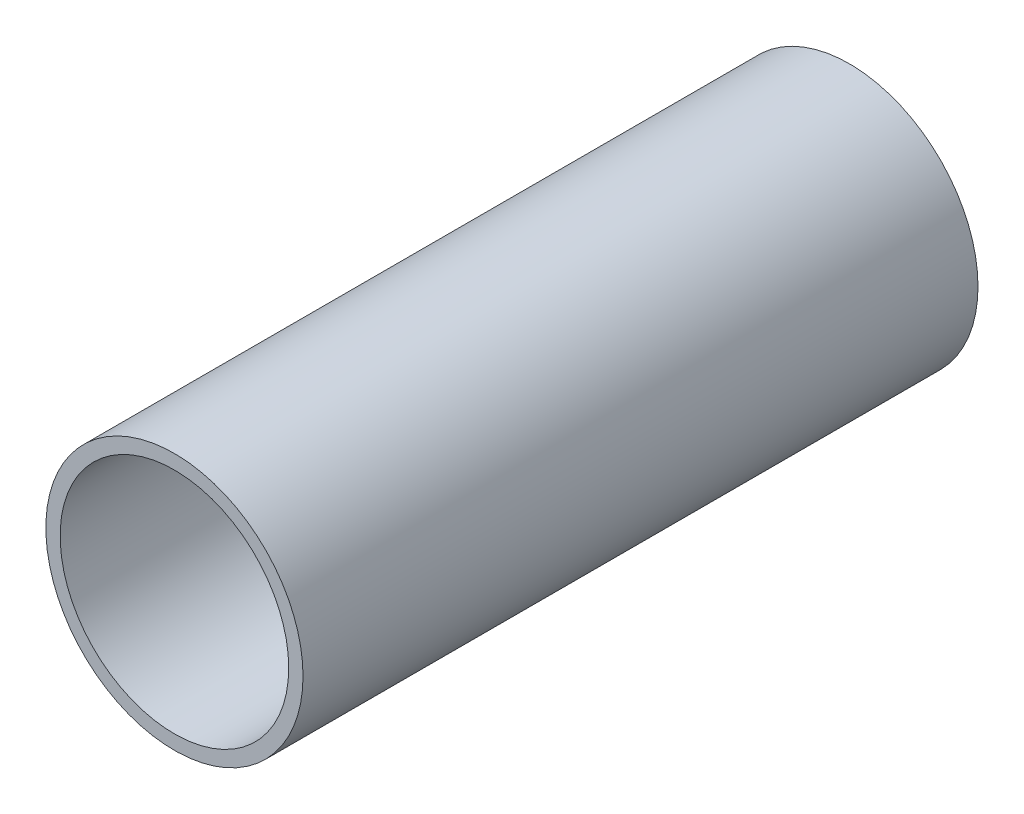
ISO-10303-21;
HEADER;
FILE_DESCRIPTION(('STEP AP214'),'2;1');
FILE_NAME('part.step','',(''),(''),'','','');
FILE_SCHEMA(('AUTOMOTIVE_DESIGN { 1 0 10303 214 1 1 1 1 }'));
ENDSEC;
DATA;
#1=APPLICATION_CONTEXT('core data for automotive mechanical design processes');
#2=APPLICATION_PROTOCOL_DEFINITION('international standard','automotive_design',2000,#1);
#3=PRODUCT_CONTEXT('',#1,'mechanical');
#4=PRODUCT('Part','Part','',(#3));
#5=PRODUCT_RELATED_PRODUCT_CATEGORY('part','',(#4));
#6=PRODUCT_DEFINITION_FORMATION('','',#4);
#7=PRODUCT_DEFINITION_CONTEXT('part definition',#1,'design');
#8=PRODUCT_DEFINITION('design','',#6,#7);
#9=PRODUCT_DEFINITION_SHAPE('','',#8);
#10=(LENGTH_UNIT() NAMED_UNIT(*) SI_UNIT(.MILLI.,.METRE.));
#11=(NAMED_UNIT(*) PLANE_ANGLE_UNIT() SI_UNIT($,.RADIAN.));
#12=(NAMED_UNIT(*) SI_UNIT($,.STERADIAN.) SOLID_ANGLE_UNIT());
#13=UNCERTAINTY_MEASURE_WITH_UNIT(LENGTH_MEASURE(1.E-05),#10,'distance_accuracy_value','');
#14=(GEOMETRIC_REPRESENTATION_CONTEXT(3) GLOBAL_UNCERTAINTY_ASSIGNED_CONTEXT((#13)) GLOBAL_UNIT_ASSIGNED_CONTEXT((#10,
#11,#12)) REPRESENTATION_CONTEXT('',''));
#15=CARTESIAN_POINT('',(0.,0.,0.));
#16=DIRECTION('',(0.,0.,1.));
#17=DIRECTION('',(1.,0.,0.));
#18=AXIS2_PLACEMENT_3D('',#15,#16,#17);
#19=CARTESIAN_POINT('',(0.,0.,300.));
#20=DIRECTION('',(0.,0.,1.));
#21=DIRECTION('',(1.,0.,0.));
#22=AXIS2_PLACEMENT_3D('',#19,#20,#21);
#23=PLANE('',#22);
#24=CARTESIAN_POINT('',(0.,0.,300.));
#25=DIRECTION('',(0.,0.,1.));
#26=DIRECTION('',(1.,0.,0.));
#27=AXIS2_PLACEMENT_3D('',#24,#25,#26);
#28=CIRCLE('',#27,57.15);
#29=CARTESIAN_POINT('',(57.15,0.,300.));
#30=VERTEX_POINT('',#29);
#31=EDGE_CURVE('E10',#30,#30,#28,.T.);
#32=ORIENTED_EDGE('',*,*,#31,.T.);
#33=EDGE_LOOP('',(#32));
#34=FACE_BOUND('',#33,.T.);
#35=CARTESIAN_POINT('',(0.,0.,300.));
#36=DIRECTION('',(0.,0.,1.));
#37=DIRECTION('',(1.,0.,0.));
#38=AXIS2_PLACEMENT_3D('',#35,#36,#37);
#39=CIRCLE('',#38,50.8);
#40=CARTESIAN_POINT('',(50.8,0.,300.));
#41=VERTEX_POINT('',#40);
#42=EDGE_CURVE('E54',#41,#41,#39,.T.);
#43=ORIENTED_EDGE('',*,*,#42,.F.);
#44=EDGE_LOOP('',(#43));
#45=FACE_BOUND('',#44,.T.);
#46=ADVANCED_FACE('F41',(#34,#45),#23,.T.);
#47=CARTESIAN_POINT('',(0.,0.,0.));
#48=DIRECTION('',(0.,0.,1.));
#49=DIRECTION('',(1.,0.,0.));
#50=AXIS2_PLACEMENT_3D('',#47,#48,#49);
#51=PLANE('',#50);
#52=CARTESIAN_POINT('',(0.,0.,0.));
#53=DIRECTION('',(0.,0.,1.));
#54=DIRECTION('',(1.,0.,0.));
#55=AXIS2_PLACEMENT_3D('',#52,#53,#54);
#56=CIRCLE('',#55,57.15);
#57=CARTESIAN_POINT('',(57.15,0.,0.));
#58=VERTEX_POINT('',#57);
#59=EDGE_CURVE('E45',#58,#58,#56,.T.);
#60=ORIENTED_EDGE('',*,*,#59,.F.);
#61=EDGE_LOOP('',(#60));
#62=FACE_BOUND('',#61,.T.);
#63=CARTESIAN_POINT('',(0.,0.,0.));
#64=DIRECTION('',(0.,0.,1.));
#65=DIRECTION('',(1.,0.,0.));
#66=AXIS2_PLACEMENT_3D('',#63,#64,#65);
#67=CIRCLE('',#66,50.8);
#68=CARTESIAN_POINT('',(50.8,0.,0.));
#69=VERTEX_POINT('',#68);
#70=EDGE_CURVE('E56',#69,#69,#67,.T.);
#71=ORIENTED_EDGE('',*,*,#70,.T.);
#72=EDGE_LOOP('',(#71));
#73=FACE_BOUND('',#72,.T.);
#74=ADVANCED_FACE('F68',(#62,#73),#51,.F.);
#75=CARTESIAN_POINT('',(0.,0.,300.));
#76=DIRECTION('',(0.,0.,-1.));
#77=DIRECTION('',(-1.,0.,0.));
#78=AXIS2_PLACEMENT_3D('',#75,#76,#77);
#79=CYLINDRICAL_SURFACE('',#78,57.15);
#80=ORIENTED_EDGE('',*,*,#31,.F.);
#81=EDGE_LOOP('',(#80));
#82=FACE_BOUND('',#81,.T.);
#83=ORIENTED_EDGE('',*,*,#59,.T.);
#84=EDGE_LOOP('',(#83));
#85=FACE_BOUND('',#84,.T.);
#86=ADVANCED_FACE('F43',(#82,#85),#79,.T.);
#87=CARTESIAN_POINT('',(0.,0.,300.));
#88=DIRECTION('',(0.,0.,-1.));
#89=DIRECTION('',(-1.,0.,0.));
#90=AXIS2_PLACEMENT_3D('',#87,#88,#89);
#91=CYLINDRICAL_SURFACE('',#90,50.8);
#92=ORIENTED_EDGE('',*,*,#42,.T.);
#93=EDGE_LOOP('',(#92));
#94=FACE_BOUND('',#93,.T.);
#95=ORIENTED_EDGE('',*,*,#70,.F.);
#96=EDGE_LOOP('',(#95));
#97=FACE_BOUND('',#96,.T.);
#98=ADVANCED_FACE('F64',(#94,#97),#91,.F.);
#99=CLOSED_SHELL('',(#46,#74,#86,#98));
#100=MANIFOLD_SOLID_BREP('B2',#99);
#101=ADVANCED_BREP_SHAPE_REPRESENTATION('',(#18,#100),#14);
#102=SHAPE_DEFINITION_REPRESENTATION(#9,#101);
ENDSEC;
END-ISO-10303-21;
